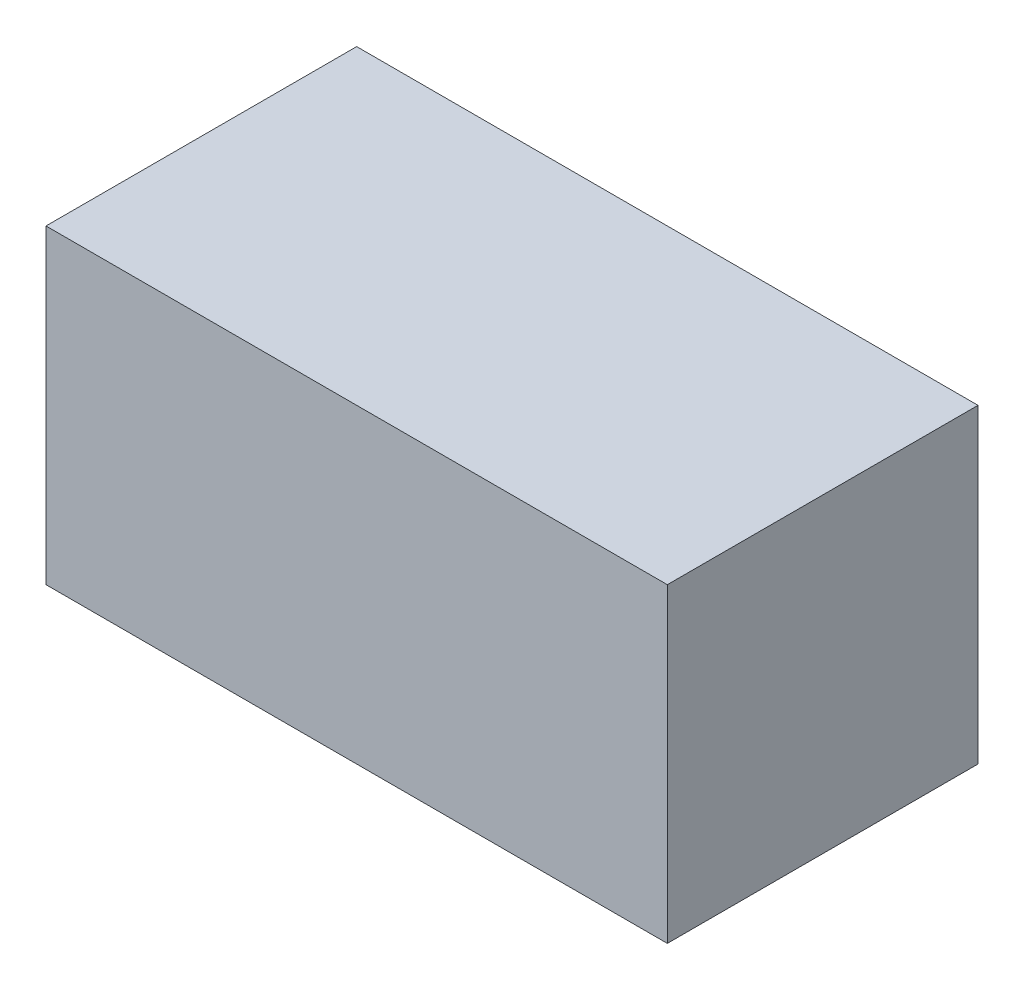
ISO-10303-21;
HEADER;
FILE_DESCRIPTION(('STEP AP214'),'2;1');
FILE_NAME('part.step','',(''),(''),'','','');
FILE_SCHEMA(('AUTOMOTIVE_DESIGN { 1 0 10303 214 1 1 1 1 }'));
ENDSEC;
DATA;
#1=APPLICATION_CONTEXT('core data for automotive mechanical design processes');
#2=APPLICATION_PROTOCOL_DEFINITION('international standard','automotive_design',2000,#1);
#3=PRODUCT_CONTEXT('',#1,'mechanical');
#4=PRODUCT('Part','Part','',(#3));
#5=PRODUCT_RELATED_PRODUCT_CATEGORY('part','',(#4));
#6=PRODUCT_DEFINITION_FORMATION('','',#4);
#7=PRODUCT_DEFINITION_CONTEXT('part definition',#1,'design');
#8=PRODUCT_DEFINITION('design','',#6,#7);
#9=PRODUCT_DEFINITION_SHAPE('','',#8);
#10=(LENGTH_UNIT() NAMED_UNIT(*) SI_UNIT(.MILLI.,.METRE.));
#11=(NAMED_UNIT(*) PLANE_ANGLE_UNIT() SI_UNIT($,.RADIAN.));
#12=(NAMED_UNIT(*) SI_UNIT($,.STERADIAN.) SOLID_ANGLE_UNIT());
#13=UNCERTAINTY_MEASURE_WITH_UNIT(LENGTH_MEASURE(1.E-05),#10,'distance_accuracy_value','');
#14=(GEOMETRIC_REPRESENTATION_CONTEXT(3) GLOBAL_UNCERTAINTY_ASSIGNED_CONTEXT((#13)) GLOBAL_UNIT_ASSIGNED_CONTEXT((#10,
#11,#12)) REPRESENTATION_CONTEXT('',''));
#15=CARTESIAN_POINT('',(0.,0.,0.));
#16=DIRECTION('',(0.,0.,1.));
#17=DIRECTION('',(1.,0.,0.));
#18=AXIS2_PLACEMENT_3D('',#15,#16,#17);
#19=CARTESIAN_POINT('',(0.,0.,10.));
#20=DIRECTION('',(1.,0.,0.));
#21=DIRECTION('',(0.,0.,-1.));
#22=AXIS2_PLACEMENT_3D('',#19,#20,#21);
#23=PLANE('',#22);
#24=DIRECTION('',(0.,-1.,0.));
#25=VECTOR('',#24,1.);
#26=CARTESIAN_POINT('',(0.,0.,0.));
#27=LINE('',#26,#25);
#28=CARTESIAN_POINT('',(0.,10.,0.));
#29=VERTEX_POINT('',#28);
#30=CARTESIAN_POINT('',(0.,0.,0.));
#31=VERTEX_POINT('',#30);
#32=EDGE_CURVE('E96',#29,#31,#27,.T.);
#33=ORIENTED_EDGE('',*,*,#32,.T.);
#34=DIRECTION('',(0.,0.,-1.));
#35=VECTOR('',#34,1.);
#36=CARTESIAN_POINT('',(0.,0.,10.));
#37=LINE('',#36,#35);
#38=CARTESIAN_POINT('',(0.,0.,10.));
#39=VERTEX_POINT('',#38);
#40=EDGE_CURVE('E11',#39,#31,#37,.T.);
#41=ORIENTED_EDGE('',*,*,#40,.F.);
#42=DIRECTION('',(0.,-1.,0.));
#43=VECTOR('',#42,1.);
#44=CARTESIAN_POINT('',(0.,0.,10.));
#45=LINE('',#44,#43);
#46=CARTESIAN_POINT('',(0.,10.,10.));
#47=VERTEX_POINT('',#46);
#48=EDGE_CURVE('E84',#47,#39,#45,.T.);
#49=ORIENTED_EDGE('',*,*,#48,.F.);
#50=DIRECTION('',(0.,0.,-1.));
#51=VECTOR('',#50,1.);
#52=CARTESIAN_POINT('',(0.,10.,10.));
#53=LINE('',#52,#51);
#54=EDGE_CURVE('E92',#47,#29,#53,.T.);
#55=ORIENTED_EDGE('',*,*,#54,.T.);
#56=EDGE_LOOP('',(#33,#41,#49,#55));
#57=FACE_BOUND('',#56,.T.);
#58=ADVANCED_FACE('F33',(#57),#23,.F.);
#59=CARTESIAN_POINT('',(0.,0.,10.));
#60=DIRECTION('',(0.,1.,0.));
#61=DIRECTION('',(0.,0.,1.));
#62=AXIS2_PLACEMENT_3D('',#59,#60,#61);
#63=PLANE('',#62);
#64=DIRECTION('',(1.,0.,0.));
#65=VECTOR('',#64,1.);
#66=CARTESIAN_POINT('',(0.,0.,0.));
#67=LINE('',#66,#65);
#68=CARTESIAN_POINT('',(20.,0.,0.));
#69=VERTEX_POINT('',#68);
#70=EDGE_CURVE('E88',#31,#69,#67,.T.);
#71=ORIENTED_EDGE('',*,*,#70,.T.);
#72=DIRECTION('',(0.,0.,-1.));
#73=VECTOR('',#72,1.);
#74=CARTESIAN_POINT('',(20.,0.,10.));
#75=LINE('',#74,#73);
#76=CARTESIAN_POINT('',(20.,0.,10.));
#77=VERTEX_POINT('',#76);
#78=EDGE_CURVE('E41',#77,#69,#75,.T.);
#79=ORIENTED_EDGE('',*,*,#78,.F.);
#80=DIRECTION('',(1.,0.,0.));
#81=VECTOR('',#80,1.);
#82=CARTESIAN_POINT('',(0.,0.,10.));
#83=LINE('',#82,#81);
#84=EDGE_CURVE('E79',#39,#77,#83,.T.);
#85=ORIENTED_EDGE('',*,*,#84,.F.);
#86=ORIENTED_EDGE('',*,*,#40,.T.);
#87=EDGE_LOOP('',(#71,#79,#85,#86));
#88=FACE_BOUND('',#87,.T.);
#89=ADVANCED_FACE('F87',(#88),#63,.F.);
#90=CARTESIAN_POINT('',(20.,0.,10.));
#91=DIRECTION('',(-1.,0.,0.));
#92=DIRECTION('',(0.,0.,1.));
#93=AXIS2_PLACEMENT_3D('',#90,#91,#92);
#94=PLANE('',#93);
#95=DIRECTION('',(0.,1.,0.));
#96=VECTOR('',#95,1.);
#97=CARTESIAN_POINT('',(20.,0.,0.));
#98=LINE('',#97,#96);
#99=CARTESIAN_POINT('',(20.,10.,0.));
#100=VERTEX_POINT('',#99);
#101=EDGE_CURVE('E66',#69,#100,#98,.T.);
#102=ORIENTED_EDGE('',*,*,#101,.T.);
#103=DIRECTION('',(0.,0.,-1.));
#104=VECTOR('',#103,1.);
#105=CARTESIAN_POINT('',(20.,10.,10.));
#106=LINE('',#105,#104);
#107=CARTESIAN_POINT('',(20.,10.,10.));
#108=VERTEX_POINT('',#107);
#109=EDGE_CURVE('E89',#108,#100,#106,.T.);
#110=ORIENTED_EDGE('',*,*,#109,.F.);
#111=DIRECTION('',(0.,1.,0.));
#112=VECTOR('',#111,1.);
#113=CARTESIAN_POINT('',(20.,0.,10.));
#114=LINE('',#113,#112);
#115=EDGE_CURVE('E82',#77,#108,#114,.T.);
#116=ORIENTED_EDGE('',*,*,#115,.F.);
#117=ORIENTED_EDGE('',*,*,#78,.T.);
#118=EDGE_LOOP('',(#102,#110,#116,#117));
#119=FACE_BOUND('',#118,.T.);
#120=ADVANCED_FACE('F90',(#119),#94,.F.);
#121=CARTESIAN_POINT('',(0.,10.,10.));
#122=DIRECTION('',(0.,-1.,0.));
#123=DIRECTION('',(0.,0.,-1.));
#124=AXIS2_PLACEMENT_3D('',#121,#122,#123);
#125=PLANE('',#124);
#126=DIRECTION('',(-1.,0.,0.));
#127=VECTOR('',#126,1.);
#128=CARTESIAN_POINT('',(0.,10.,0.));
#129=LINE('',#128,#127);
#130=EDGE_CURVE('E72',#100,#29,#129,.T.);
#131=ORIENTED_EDGE('',*,*,#130,.T.);
#132=ORIENTED_EDGE('',*,*,#54,.F.);
#133=DIRECTION('',(-1.,0.,0.));
#134=VECTOR('',#133,1.);
#135=CARTESIAN_POINT('',(0.,10.,10.));
#136=LINE('',#135,#134);
#137=EDGE_CURVE('E49',#108,#47,#136,.T.);
#138=ORIENTED_EDGE('',*,*,#137,.F.);
#139=ORIENTED_EDGE('',*,*,#109,.T.);
#140=EDGE_LOOP('',(#131,#132,#138,#139));
#141=FACE_BOUND('',#140,.T.);
#142=ADVANCED_FACE('F103',(#141),#125,.F.);
#143=CARTESIAN_POINT('',(0.,0.,10.));
#144=DIRECTION('',(0.,0.,-1.));
#145=DIRECTION('',(-1.,0.,0.));
#146=AXIS2_PLACEMENT_3D('',#143,#144,#145);
#147=PLANE('',#146);
#148=ORIENTED_EDGE('',*,*,#48,.T.);
#149=ORIENTED_EDGE('',*,*,#84,.T.);
#150=ORIENTED_EDGE('',*,*,#115,.T.);
#151=ORIENTED_EDGE('',*,*,#137,.T.);
#152=EDGE_LOOP('',(#148,#149,#150,#151));
#153=FACE_BOUND('',#152,.T.);
#154=ADVANCED_FACE('F80',(#153),#147,.F.);
#155=CARTESIAN_POINT('',(0.,0.,0.));
#156=DIRECTION('',(0.,0.,-1.));
#157=DIRECTION('',(-1.,0.,0.));
#158=AXIS2_PLACEMENT_3D('',#155,#156,#157);
#159=PLANE('',#158);
#160=ORIENTED_EDGE('',*,*,#32,.F.);
#161=ORIENTED_EDGE('',*,*,#130,.F.);
#162=ORIENTED_EDGE('',*,*,#101,.F.);
#163=ORIENTED_EDGE('',*,*,#70,.F.);
#164=EDGE_LOOP('',(#160,#161,#162,#163));
#165=FACE_BOUND('',#164,.T.);
#166=ADVANCED_FACE('F106',(#165),#159,.T.);
#167=CLOSED_SHELL('',(#58,#89,#120,#142,#154,#166));
#168=MANIFOLD_SOLID_BREP('B2',#167);
#169=ADVANCED_BREP_SHAPE_REPRESENTATION('',(#18,#168),#14);
#170=SHAPE_DEFINITION_REPRESENTATION(#9,#169);
ENDSEC;
END-ISO-10303-21;
